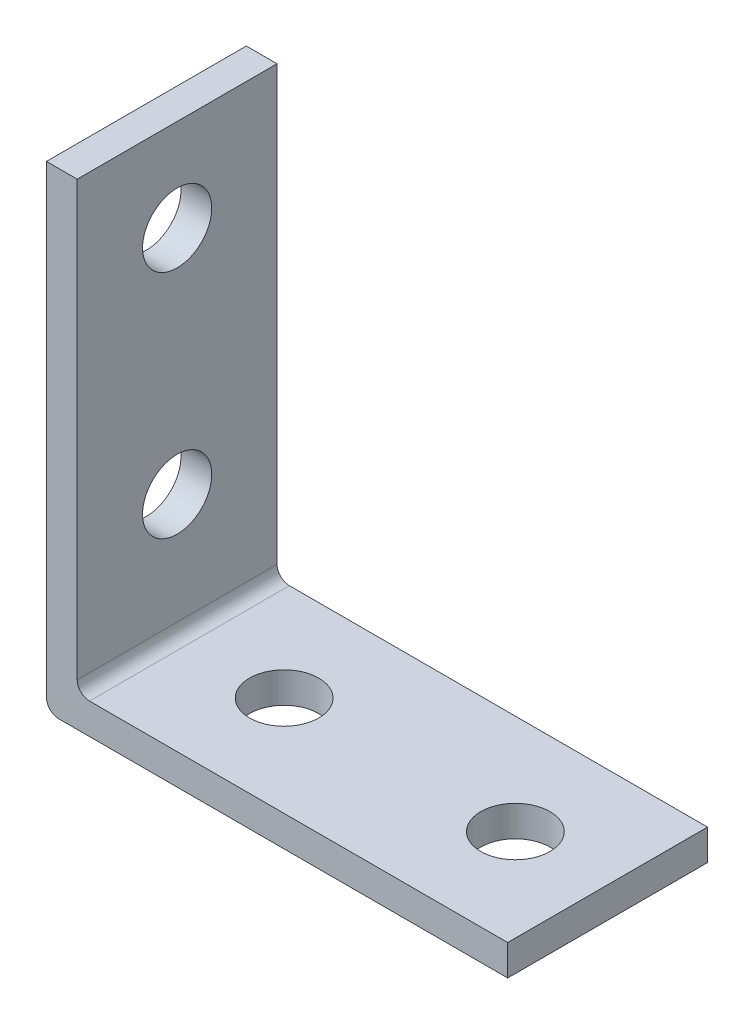
ISO-10303-21;
HEADER;
FILE_DESCRIPTION(('STEP AP214'),'2;1');
FILE_NAME('part.step','',(''),(''),'','','');
FILE_SCHEMA(('AUTOMOTIVE_DESIGN { 1 0 10303 214 1 1 1 1 }'));
ENDSEC;
DATA;
#1=APPLICATION_CONTEXT('core data for automotive mechanical design processes');
#2=APPLICATION_PROTOCOL_DEFINITION('international standard','automotive_design',2000,#1);
#3=PRODUCT_CONTEXT('',#1,'mechanical');
#4=PRODUCT('Part','Part','',(#3));
#5=PRODUCT_RELATED_PRODUCT_CATEGORY('part','',(#4));
#6=PRODUCT_DEFINITION_FORMATION('','',#4);
#7=PRODUCT_DEFINITION_CONTEXT('part definition',#1,'design');
#8=PRODUCT_DEFINITION('design','',#6,#7);
#9=PRODUCT_DEFINITION_SHAPE('','',#8);
#10=(LENGTH_UNIT() NAMED_UNIT(*) SI_UNIT(.MILLI.,.METRE.));
#11=(NAMED_UNIT(*) PLANE_ANGLE_UNIT() SI_UNIT($,.RADIAN.));
#12=(NAMED_UNIT(*) SI_UNIT($,.STERADIAN.) SOLID_ANGLE_UNIT());
#13=UNCERTAINTY_MEASURE_WITH_UNIT(LENGTH_MEASURE(1.E-05),#10,'distance_accuracy_value','');
#14=(GEOMETRIC_REPRESENTATION_CONTEXT(3) GLOBAL_UNCERTAINTY_ASSIGNED_CONTEXT((#13)) GLOBAL_UNIT_ASSIGNED_CONTEXT((#10,
#11,#12)) REPRESENTATION_CONTEXT('',''));
#15=CARTESIAN_POINT('',(0.,0.,0.));
#16=DIRECTION('',(0.,0.,1.));
#17=DIRECTION('',(1.,0.,0.));
#18=AXIS2_PLACEMENT_3D('',#15,#16,#17);
#19=CARTESIAN_POINT('',(-39.6773051646897,-5.92291601227651,41.275));
#20=DIRECTION('',(0.,0.,-1.));
#21=DIRECTION('',(-1.,0.,0.));
#22=AXIS2_PLACEMENT_3D('',#19,#20,#21);
#23=CYLINDRICAL_SURFACE('',#22,2.54);
#24=CARTESIAN_POINT('',(-39.6773051646897,-5.92291601227651,0.));
#25=DIRECTION('',(0.,0.,1.));
#26=DIRECTION('',(1.,0.,0.));
#27=AXIS2_PLACEMENT_3D('',#24,#25,#26);
#28=CIRCLE('',#27,2.54);
#29=CARTESIAN_POINT('',(-39.6773051646897,-8.46291601227651,0.));
#30=VERTEX_POINT('',#29);
#31=CARTESIAN_POINT('',(-42.2173051646897,-5.9229160122765,0.));
#32=VERTEX_POINT('',#31);
#33=EDGE_CURVE('E130',#30,#32,#28,.F.);
#34=ORIENTED_EDGE('',*,*,#33,.F.);
#35=DIRECTION('',(0.,0.,-1.));
#36=VECTOR('',#35,1.);
#37=CARTESIAN_POINT('',(-39.6773051646897,-8.46291601227651,41.275));
#38=LINE('',#37,#36);
#39=CARTESIAN_POINT('',(-39.6773051646897,-8.46291601227651,41.275));
#40=VERTEX_POINT('',#39);
#41=EDGE_CURVE('E11',#40,#30,#38,.T.);
#42=ORIENTED_EDGE('',*,*,#41,.F.);
#43=CARTESIAN_POINT('',(-39.6773051646897,-5.92291601227651,41.275));
#44=DIRECTION('',(0.,0.,1.));
#45=DIRECTION('',(1.,0.,0.));
#46=AXIS2_PLACEMENT_3D('',#43,#44,#45);
#47=CIRCLE('',#46,2.54);
#48=CARTESIAN_POINT('',(-42.2173051646897,-5.9229160122765,41.275));
#49=VERTEX_POINT('',#48);
#50=EDGE_CURVE('E150',#40,#49,#47,.F.);
#51=ORIENTED_EDGE('',*,*,#50,.T.);
#52=DIRECTION('',(0.,0.,-1.));
#53=VECTOR('',#52,1.);
#54=CARTESIAN_POINT('',(-42.2173051646897,-5.9229160122765,41.275));
#55=LINE('',#54,#53);
#56=EDGE_CURVE('E86',#49,#32,#55,.T.);
#57=ORIENTED_EDGE('',*,*,#56,.T.);
#58=EDGE_LOOP('',(#34,#42,#51,#57));
#59=FACE_BOUND('',#58,.T.);
#60=ADVANCED_FACE('F34',(#59),#23,.T.);
#61=CARTESIAN_POINT('',(0.,-8.46291601227651,41.275));
#62=DIRECTION('',(0.,1.,0.));
#63=DIRECTION('',(0.,0.,1.));
#64=AXIS2_PLACEMENT_3D('',#61,#62,#63);
#65=PLANE('',#64);
#66=CARTESIAN_POINT('',(33.9826948353103,-8.46291601227651,20.6375));
#67=DIRECTION('',(0.,1.,0.));
#68=DIRECTION('',(0.,0.,1.));
#69=AXIS2_PLACEMENT_3D('',#66,#67,#68);
#70=CIRCLE('',#69,7.14375);
#71=CARTESIAN_POINT('',(33.9826948353103,-8.46291601227651,27.78125));
#72=VERTEX_POINT('',#71);
#73=EDGE_CURVE('E246',#72,#72,#70,.T.);
#74=ORIENTED_EDGE('',*,*,#73,.T.);
#75=EDGE_LOOP('',(#74));
#76=FACE_BOUND('',#75,.T.);
#77=CARTESIAN_POINT('',(-13.7693051646897,-8.46291601227651,20.6375));
#78=DIRECTION('',(0.,1.,0.));
#79=DIRECTION('',(0.,0.,1.));
#80=AXIS2_PLACEMENT_3D('',#77,#78,#79);
#81=CIRCLE('',#80,7.14375);
#82=CARTESIAN_POINT('',(-13.7693051646897,-8.46291601227651,27.78125));
#83=VERTEX_POINT('',#82);
#84=EDGE_CURVE('E250',#83,#83,#81,.T.);
#85=ORIENTED_EDGE('',*,*,#84,.T.);
#86=EDGE_LOOP('',(#85));
#87=FACE_BOUND('',#86,.T.);
#88=DIRECTION('',(1.,0.,0.));
#89=VECTOR('',#88,1.);
#90=CARTESIAN_POINT('',(0.,-8.46291601227651,0.));
#91=LINE('',#90,#89);
#92=CARTESIAN_POINT('',(53.0326948353103,-8.46291601227651,0.));
#93=VERTEX_POINT('',#92);
#94=EDGE_CURVE('E133',#30,#93,#91,.T.);
#95=ORIENTED_EDGE('',*,*,#94,.T.);
#96=DIRECTION('',(0.,0.,-1.));
#97=VECTOR('',#96,1.);
#98=CARTESIAN_POINT('',(53.0326948353103,-8.46291601227651,41.275));
#99=LINE('',#98,#97);
#100=CARTESIAN_POINT('',(53.0326948353103,-8.46291601227651,41.275));
#101=VERTEX_POINT('',#100);
#102=EDGE_CURVE('E43',#101,#93,#99,.T.);
#103=ORIENTED_EDGE('',*,*,#102,.F.);
#104=DIRECTION('',(1.,0.,0.));
#105=VECTOR('',#104,1.);
#106=CARTESIAN_POINT('',(0.,-8.46291601227651,41.275));
#107=LINE('',#106,#105);
#108=EDGE_CURVE('E173',#40,#101,#107,.T.);
#109=ORIENTED_EDGE('',*,*,#108,.F.);
#110=ORIENTED_EDGE('',*,*,#41,.T.);
#111=EDGE_LOOP('',(#95,#103,#109,#110));
#112=FACE_BOUND('',#111,.T.);
#113=ADVANCED_FACE('F205',(#76,#87,#112),#65,.F.);
#114=CARTESIAN_POINT('',(53.0326948353103,0.,41.275));
#115=DIRECTION('',(-1.,0.,0.));
#116=DIRECTION('',(0.,0.,1.));
#117=AXIS2_PLACEMENT_3D('',#114,#115,#116);
#118=PLANE('',#117);
#119=DIRECTION('',(0.,1.,0.));
#120=VECTOR('',#119,1.);
#121=CARTESIAN_POINT('',(53.0326948353103,0.,0.));
#122=LINE('',#121,#120);
#123=CARTESIAN_POINT('',(53.0326948353103,-2.11291601227651,0.));
#124=VERTEX_POINT('',#123);
#125=EDGE_CURVE('E136',#93,#124,#122,.T.);
#126=ORIENTED_EDGE('',*,*,#125,.T.);
#127=DIRECTION('',(0.,0.,-1.));
#128=VECTOR('',#127,1.);
#129=CARTESIAN_POINT('',(53.0326948353103,-2.11291601227651,41.275));
#130=LINE('',#129,#128);
#131=CARTESIAN_POINT('',(53.0326948353103,-2.11291601227651,41.275));
#132=VERTEX_POINT('',#131);
#133=EDGE_CURVE('E156',#132,#124,#130,.T.);
#134=ORIENTED_EDGE('',*,*,#133,.F.);
#135=DIRECTION('',(0.,1.,0.));
#136=VECTOR('',#135,1.);
#137=CARTESIAN_POINT('',(53.0326948353103,0.,41.275));
#138=LINE('',#137,#136);
#139=EDGE_CURVE('E175',#101,#132,#138,.T.);
#140=ORIENTED_EDGE('',*,*,#139,.F.);
#141=ORIENTED_EDGE('',*,*,#102,.T.);
#142=EDGE_LOOP('',(#126,#134,#140,#141));
#143=FACE_BOUND('',#142,.T.);
#144=ADVANCED_FACE('F186',(#143),#118,.F.);
#145=CARTESIAN_POINT('',(0.,-2.11291601227652,41.275));
#146=DIRECTION('',(0.,1.,0.));
#147=DIRECTION('',(-1.,0.,0.));
#148=AXIS2_PLACEMENT_3D('',#145,#146,#147);
#149=PLANE('',#148);
#150=CARTESIAN_POINT('',(33.9826948353103,-2.11291601227652,20.6375));
#151=DIRECTION('',(0.,1.,0.));
#152=DIRECTION('',(-1.,0.,0.));
#153=AXIS2_PLACEMENT_3D('',#150,#151,#152);
#154=CIRCLE('',#153,7.14375);
#155=CARTESIAN_POINT('',(26.8389448353103,-2.11291601227652,20.6375));
#156=VERTEX_POINT('',#155);
#157=EDGE_CURVE('E243',#156,#156,#154,.T.);
#158=ORIENTED_EDGE('',*,*,#157,.F.);
#159=EDGE_LOOP('',(#158));
#160=FACE_BOUND('',#159,.T.);
#161=CARTESIAN_POINT('',(-13.7693051646897,-2.11291601227652,20.6375));
#162=DIRECTION('',(0.,1.,0.));
#163=DIRECTION('',(-1.,0.,0.));
#164=AXIS2_PLACEMENT_3D('',#161,#162,#163);
#165=CIRCLE('',#164,7.14375);
#166=CARTESIAN_POINT('',(-20.9130551646897,-2.11291601227652,20.6375));
#167=VERTEX_POINT('',#166);
#168=EDGE_CURVE('E247',#167,#167,#165,.T.);
#169=ORIENTED_EDGE('',*,*,#168,.F.);
#170=EDGE_LOOP('',(#169));
#171=FACE_BOUND('',#170,.T.);
#172=DIRECTION('',(1.,0.,0.));
#173=VECTOR('',#172,1.);
#174=CARTESIAN_POINT('',(0.,-2.11291601227652,0.));
#175=LINE('',#174,#173);
#176=CARTESIAN_POINT('',(-33.3273051646897,-2.11291601227652,0.));
#177=VERTEX_POINT('',#176);
#178=EDGE_CURVE('E139',#177,#124,#175,.T.);
#179=ORIENTED_EDGE('',*,*,#178,.F.);
#180=DIRECTION('',(0.,0.,-1.));
#181=VECTOR('',#180,1.);
#182=CARTESIAN_POINT('',(-33.3273051646897,-2.11291601227652,41.275));
#183=LINE('',#182,#181);
#184=CARTESIAN_POINT('',(-33.3273051646897,-2.11291601227652,41.275));
#185=VERTEX_POINT('',#184);
#186=EDGE_CURVE('E154',#185,#177,#183,.T.);
#187=ORIENTED_EDGE('',*,*,#186,.F.);
#188=DIRECTION('',(1.,0.,0.));
#189=VECTOR('',#188,1.);
#190=CARTESIAN_POINT('',(0.,-2.11291601227652,41.275));
#191=LINE('',#190,#189);
#192=EDGE_CURVE('E177',#185,#132,#191,.T.);
#193=ORIENTED_EDGE('',*,*,#192,.T.);
#194=ORIENTED_EDGE('',*,*,#133,.T.);
#195=EDGE_LOOP('',(#179,#187,#193,#194));
#196=FACE_BOUND('',#195,.T.);
#197=ADVANCED_FACE('F181',(#160,#171,#196),#149,.T.);
#198=CARTESIAN_POINT('',(-33.3273051646897,0.427083987723483,41.275));
#199=DIRECTION('',(0.,0.,-1.));
#200=DIRECTION('',(-1.,0.,0.));
#201=AXIS2_PLACEMENT_3D('',#198,#199,#200);
#202=CYLINDRICAL_SURFACE('',#201,2.54);
#203=CARTESIAN_POINT('',(-33.3273051646897,0.427083987723483,0.));
#204=DIRECTION('',(0.,0.,1.));
#205=DIRECTION('',(1.,0.,0.));
#206=AXIS2_PLACEMENT_3D('',#203,#204,#205);
#207=CIRCLE('',#206,2.54);
#208=CARTESIAN_POINT('',(-35.8673051646897,0.4270839877235,0.));
#209=VERTEX_POINT('',#208);
#210=EDGE_CURVE('E142',#177,#209,#207,.F.);
#211=ORIENTED_EDGE('',*,*,#210,.T.);
#212=DIRECTION('',(0.,0.,-1.));
#213=VECTOR('',#212,1.);
#214=CARTESIAN_POINT('',(-35.8673051646897,0.4270839877235,41.275));
#215=LINE('',#214,#213);
#216=CARTESIAN_POINT('',(-35.8673051646897,0.4270839877235,41.275));
#217=VERTEX_POINT('',#216);
#218=EDGE_CURVE('E116',#217,#209,#215,.T.);
#219=ORIENTED_EDGE('',*,*,#218,.F.);
#220=CARTESIAN_POINT('',(-33.3273051646897,0.427083987723483,41.275));
#221=DIRECTION('',(0.,0.,1.));
#222=DIRECTION('',(1.,0.,0.));
#223=AXIS2_PLACEMENT_3D('',#220,#221,#222);
#224=CIRCLE('',#223,2.54);
#225=EDGE_CURVE('E122',#185,#217,#224,.F.);
#226=ORIENTED_EDGE('',*,*,#225,.F.);
#227=ORIENTED_EDGE('',*,*,#186,.T.);
#228=EDGE_LOOP('',(#211,#219,#226,#227));
#229=FACE_BOUND('',#228,.T.);
#230=ADVANCED_FACE('F193',(#229),#202,.F.);
#231=CARTESIAN_POINT('',(-35.8673051646897,0.,41.275));
#232=DIRECTION('',(1.,0.,0.));
#233=DIRECTION('',(0.,1.,0.));
#234=AXIS2_PLACEMENT_3D('',#231,#232,#233);
#235=PLANE('',#234);
#236=CARTESIAN_POINT('',(-35.8673051646897,23.2870839877235,20.6375));
#237=DIRECTION('',(1.,0.,0.));
#238=DIRECTION('',(0.,1.,0.));
#239=AXIS2_PLACEMENT_3D('',#236,#237,#238);
#240=CIRCLE('',#239,7.14375);
#241=CARTESIAN_POINT('',(-35.8673051646897,30.4308339877235,20.6375));
#242=VERTEX_POINT('',#241);
#243=EDGE_CURVE('E168',#242,#242,#240,.T.);
#244=ORIENTED_EDGE('',*,*,#243,.F.);
#245=EDGE_LOOP('',(#244));
#246=FACE_BOUND('',#245,.T.);
#247=CARTESIAN_POINT('',(-35.8673051646897,70.9120839877235,20.6375));
#248=DIRECTION('',(1.,0.,0.));
#249=DIRECTION('',(0.,1.,0.));
#250=AXIS2_PLACEMENT_3D('',#247,#248,#249);
#251=CIRCLE('',#250,7.14375000000001);
#252=CARTESIAN_POINT('',(-35.8673051646897,78.0558339877235,20.6375));
#253=VERTEX_POINT('',#252);
#254=EDGE_CURVE('E160',#253,#253,#251,.T.);
#255=ORIENTED_EDGE('',*,*,#254,.F.);
#256=EDGE_LOOP('',(#255));
#257=FACE_BOUND('',#256,.T.);
#258=DIRECTION('',(0.,-1.,0.));
#259=VECTOR('',#258,1.);
#260=CARTESIAN_POINT('',(-35.8673051646897,0.,0.));
#261=LINE('',#260,#259);
#262=CARTESIAN_POINT('',(-35.8673051646897,89.9620839877235,0.));
#263=VERTEX_POINT('',#262);
#264=EDGE_CURVE('E111',#263,#209,#261,.T.);
#265=ORIENTED_EDGE('',*,*,#264,.F.);
#266=DIRECTION('',(0.,0.,-1.));
#267=VECTOR('',#266,1.);
#268=CARTESIAN_POINT('',(-35.8673051646897,89.9620839877235,41.275));
#269=LINE('',#268,#267);
#270=CARTESIAN_POINT('',(-35.8673051646897,89.9620839877235,41.275));
#271=VERTEX_POINT('',#270);
#272=EDGE_CURVE('E106',#271,#263,#269,.T.);
#273=ORIENTED_EDGE('',*,*,#272,.F.);
#274=DIRECTION('',(0.,-1.,0.));
#275=VECTOR('',#274,1.);
#276=CARTESIAN_POINT('',(-35.8673051646897,0.,41.275));
#277=LINE('',#276,#275);
#278=EDGE_CURVE('E109',#271,#217,#277,.T.);
#279=ORIENTED_EDGE('',*,*,#278,.T.);
#280=ORIENTED_EDGE('',*,*,#218,.T.);
#281=EDGE_LOOP('',(#265,#273,#279,#280));
#282=FACE_BOUND('',#281,.T.);
#283=ADVANCED_FACE('F108',(#246,#257,#282),#235,.T.);
#284=CARTESIAN_POINT('',(0.,89.9620839877235,41.275));
#285=DIRECTION('',(0.,1.,0.));
#286=DIRECTION('',(0.,0.,1.));
#287=AXIS2_PLACEMENT_3D('',#284,#285,#286);
#288=PLANE('',#287);
#289=DIRECTION('',(1.,0.,0.));
#290=VECTOR('',#289,1.);
#291=CARTESIAN_POINT('',(0.,89.9620839877235,0.));
#292=LINE('',#291,#290);
#293=CARTESIAN_POINT('',(-42.2173051646897,89.9620839877235,0.));
#294=VERTEX_POINT('',#293);
#295=EDGE_CURVE('E146',#294,#263,#292,.T.);
#296=ORIENTED_EDGE('',*,*,#295,.F.);
#297=DIRECTION('',(0.,0.,-1.));
#298=VECTOR('',#297,1.);
#299=CARTESIAN_POINT('',(-42.2173051646897,89.9620839877235,41.275));
#300=LINE('',#299,#298);
#301=CARTESIAN_POINT('',(-42.2173051646897,89.9620839877235,41.275));
#302=VERTEX_POINT('',#301);
#303=EDGE_CURVE('E79',#302,#294,#300,.T.);
#304=ORIENTED_EDGE('',*,*,#303,.F.);
#305=DIRECTION('',(1.,0.,0.));
#306=VECTOR('',#305,1.);
#307=CARTESIAN_POINT('',(0.,89.9620839877235,41.275));
#308=LINE('',#307,#306);
#309=EDGE_CURVE('E119',#302,#271,#308,.T.);
#310=ORIENTED_EDGE('',*,*,#309,.T.);
#311=ORIENTED_EDGE('',*,*,#272,.T.);
#312=EDGE_LOOP('',(#296,#304,#310,#311));
#313=FACE_BOUND('',#312,.T.);
#314=ADVANCED_FACE('F125',(#313),#288,.T.);
#315=CARTESIAN_POINT('',(-42.2173051646897,0.,41.275));
#316=DIRECTION('',(1.,0.,0.));
#317=DIRECTION('',(0.,1.,0.));
#318=AXIS2_PLACEMENT_3D('',#315,#316,#317);
#319=PLANE('',#318);
#320=CARTESIAN_POINT('',(-42.2173051646897,23.2870839877235,20.6375));
#321=DIRECTION('',(1.,0.,0.));
#322=DIRECTION('',(0.,1.,0.));
#323=AXIS2_PLACEMENT_3D('',#320,#321,#322);
#324=CIRCLE('',#323,7.14375);
#325=CARTESIAN_POINT('',(-42.2173051646897,30.4308339877235,20.6375));
#326=VERTEX_POINT('',#325);
#327=EDGE_CURVE('E37',#326,#326,#324,.T.);
#328=ORIENTED_EDGE('',*,*,#327,.T.);
#329=EDGE_LOOP('',(#328));
#330=FACE_BOUND('',#329,.T.);
#331=CARTESIAN_POINT('',(-42.2173051646897,70.9120839877235,20.6375));
#332=DIRECTION('',(1.,0.,0.));
#333=DIRECTION('',(0.,1.,0.));
#334=AXIS2_PLACEMENT_3D('',#331,#332,#333);
#335=CIRCLE('',#334,7.14375000000001);
#336=CARTESIAN_POINT('',(-42.2173051646897,78.0558339877235,20.6375));
#337=VERTEX_POINT('',#336);
#338=EDGE_CURVE('E134',#337,#337,#335,.T.);
#339=ORIENTED_EDGE('',*,*,#338,.T.);
#340=EDGE_LOOP('',(#339));
#341=FACE_BOUND('',#340,.T.);
#342=DIRECTION('',(0.,-1.,0.));
#343=VECTOR('',#342,1.);
#344=CARTESIAN_POINT('',(-42.2173051646897,0.,0.));
#345=LINE('',#344,#343);
#346=EDGE_CURVE('E148',#294,#32,#345,.T.);
#347=ORIENTED_EDGE('',*,*,#346,.T.);
#348=ORIENTED_EDGE('',*,*,#56,.F.);
#349=DIRECTION('',(0.,-1.,0.));
#350=VECTOR('',#349,1.);
#351=CARTESIAN_POINT('',(-42.2173051646897,0.,41.275));
#352=LINE('',#351,#350);
#353=EDGE_CURVE('E52',#302,#49,#352,.T.);
#354=ORIENTED_EDGE('',*,*,#353,.F.);
#355=ORIENTED_EDGE('',*,*,#303,.T.);
#356=EDGE_LOOP('',(#347,#348,#354,#355));
#357=FACE_BOUND('',#356,.T.);
#358=ADVANCED_FACE('F211',(#330,#341,#357),#319,.F.);
#359=CARTESIAN_POINT('',(0.,0.,41.275));
#360=DIRECTION('',(0.,0.,1.));
#361=DIRECTION('',(1.,0.,0.));
#362=AXIS2_PLACEMENT_3D('',#359,#360,#361);
#363=PLANE('',#362);
#364=ORIENTED_EDGE('',*,*,#50,.F.);
#365=ORIENTED_EDGE('',*,*,#108,.T.);
#366=ORIENTED_EDGE('',*,*,#139,.T.);
#367=ORIENTED_EDGE('',*,*,#192,.F.);
#368=ORIENTED_EDGE('',*,*,#225,.T.);
#369=ORIENTED_EDGE('',*,*,#278,.F.);
#370=ORIENTED_EDGE('',*,*,#309,.F.);
#371=ORIENTED_EDGE('',*,*,#353,.T.);
#372=EDGE_LOOP('',(#364,#365,#366,#367,#368,#369,#370,#371));
#373=FACE_BOUND('',#372,.T.);
#374=ADVANCED_FACE('F118',(#373),#363,.T.);
#375=CARTESIAN_POINT('',(0.,0.,0.));
#376=DIRECTION('',(0.,0.,1.));
#377=DIRECTION('',(1.,0.,0.));
#378=AXIS2_PLACEMENT_3D('',#375,#376,#377);
#379=PLANE('',#378);
#380=ORIENTED_EDGE('',*,*,#33,.T.);
#381=ORIENTED_EDGE('',*,*,#346,.F.);
#382=ORIENTED_EDGE('',*,*,#295,.T.);
#383=ORIENTED_EDGE('',*,*,#264,.T.);
#384=ORIENTED_EDGE('',*,*,#210,.F.);
#385=ORIENTED_EDGE('',*,*,#178,.T.);
#386=ORIENTED_EDGE('',*,*,#125,.F.);
#387=ORIENTED_EDGE('',*,*,#94,.F.);
#388=EDGE_LOOP('',(#380,#381,#382,#383,#384,#385,#386,#387));
#389=FACE_BOUND('',#388,.T.);
#390=ADVANCED_FACE('F191',(#389),#379,.F.);
#391=CARTESIAN_POINT('',(-77.1423051646897,70.9120839877235,20.6375));
#392=DIRECTION('',(1.,0.,0.));
#393=DIRECTION('',(0.,1.,0.));
#394=AXIS2_PLACEMENT_3D('',#391,#392,#393);
#395=CYLINDRICAL_SURFACE('',#394,7.14375000000001);
#396=ORIENTED_EDGE('',*,*,#254,.T.);
#397=EDGE_LOOP('',(#396));
#398=FACE_BOUND('',#397,.T.);
#399=ORIENTED_EDGE('',*,*,#338,.F.);
#400=EDGE_LOOP('',(#399));
#401=FACE_BOUND('',#400,.T.);
#402=ADVANCED_FACE('F223',(#398,#401),#395,.F.);
#403=CARTESIAN_POINT('',(-77.1423051646897,23.2870839877235,20.6375));
#404=DIRECTION('',(1.,0.,0.));
#405=DIRECTION('',(0.,1.,0.));
#406=AXIS2_PLACEMENT_3D('',#403,#404,#405);
#407=CYLINDRICAL_SURFACE('',#406,7.14375);
#408=ORIENTED_EDGE('',*,*,#243,.T.);
#409=EDGE_LOOP('',(#408));
#410=FACE_BOUND('',#409,.T.);
#411=ORIENTED_EDGE('',*,*,#327,.F.);
#412=EDGE_LOOP('',(#411));
#413=FACE_BOUND('',#412,.T.);
#414=ADVANCED_FACE('F227',(#410,#413),#407,.F.);
#415=CARTESIAN_POINT('',(-13.7693051646897,-43.3879160122765,20.6375));
#416=DIRECTION('',(0.,1.,0.));
#417=DIRECTION('',(-1.,0.,0.));
#418=AXIS2_PLACEMENT_3D('',#415,#416,#417);
#419=CYLINDRICAL_SURFACE('',#418,7.14375);
#420=ORIENTED_EDGE('',*,*,#168,.T.);
#421=EDGE_LOOP('',(#420));
#422=FACE_BOUND('',#421,.T.);
#423=ORIENTED_EDGE('',*,*,#84,.F.);
#424=EDGE_LOOP('',(#423));
#425=FACE_BOUND('',#424,.T.);
#426=ADVANCED_FACE('F230',(#422,#425),#419,.F.);
#427=CARTESIAN_POINT('',(33.9826948353103,-43.3879160122765,20.6375));
#428=DIRECTION('',(0.,1.,0.));
#429=DIRECTION('',(-1.,0.,0.));
#430=AXIS2_PLACEMENT_3D('',#427,#428,#429);
#431=CYLINDRICAL_SURFACE('',#430,7.14375);
#432=ORIENTED_EDGE('',*,*,#157,.T.);
#433=EDGE_LOOP('',(#432));
#434=FACE_BOUND('',#433,.T.);
#435=ORIENTED_EDGE('',*,*,#73,.F.);
#436=EDGE_LOOP('',(#435));
#437=FACE_BOUND('',#436,.T.);
#438=ADVANCED_FACE('F234',(#434,#437),#431,.F.);
#439=CLOSED_SHELL('',(#60,#113,#144,#197,#230,#283,#314,#358,#374,#390,#402,#414,#426,#438));
#440=MANIFOLD_SOLID_BREP('B2',#439);
#441=ADVANCED_BREP_SHAPE_REPRESENTATION('',(#18,#440),#14);
#442=SHAPE_DEFINITION_REPRESENTATION(#9,#441);
ENDSEC;
END-ISO-10303-21;
